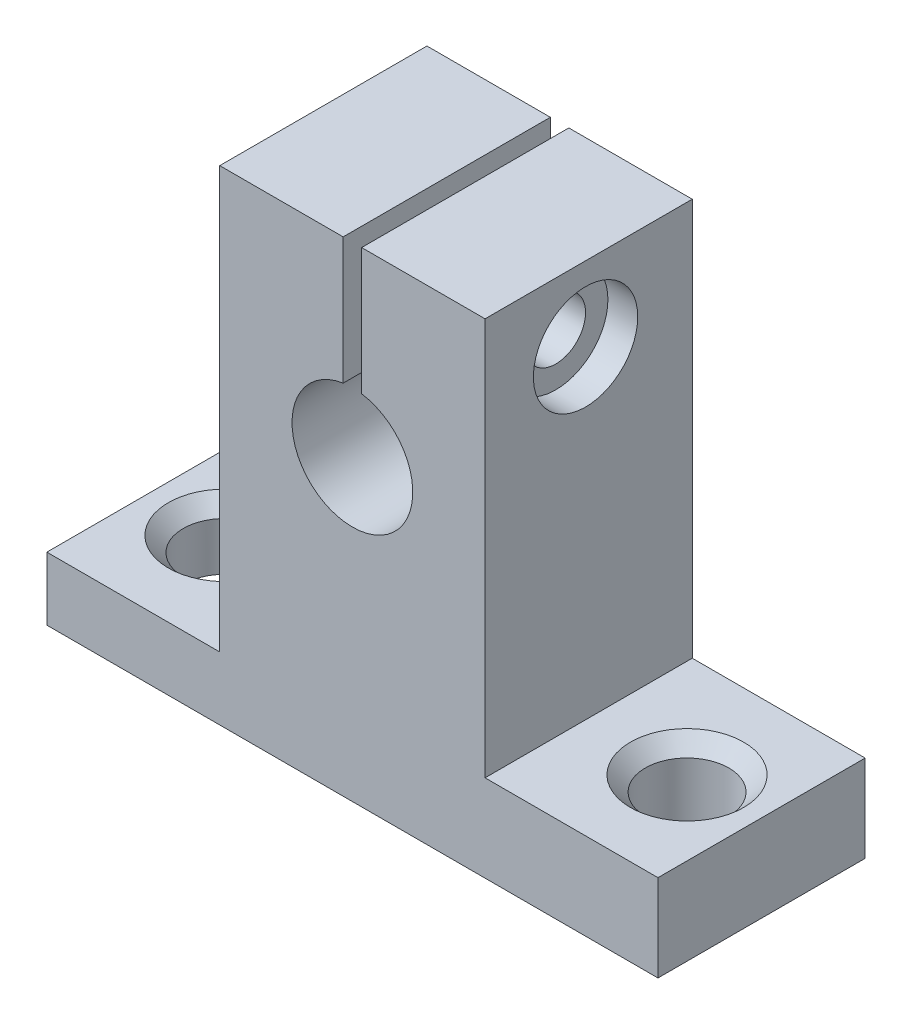
ISO-10303-21;
HEADER;
FILE_DESCRIPTION(('STEP AP214'),'2;1');
FILE_NAME('part.step','',(''),(''),'','','');
FILE_SCHEMA(('AUTOMOTIVE_DESIGN { 1 0 10303 214 1 1 1 1 }'));
ENDSEC;
DATA;
#1=APPLICATION_CONTEXT('core data for automotive mechanical design processes');
#2=APPLICATION_PROTOCOL_DEFINITION('international standard','automotive_design',2000,#1);
#3=PRODUCT_CONTEXT('',#1,'mechanical');
#4=PRODUCT('Part','Part','',(#3));
#5=PRODUCT_RELATED_PRODUCT_CATEGORY('part','',(#4));
#6=PRODUCT_DEFINITION_FORMATION('','',#4);
#7=PRODUCT_DEFINITION_CONTEXT('part definition',#1,'design');
#8=PRODUCT_DEFINITION('design','',#6,#7);
#9=PRODUCT_DEFINITION_SHAPE('','',#8);
#10=(LENGTH_UNIT() NAMED_UNIT(*) SI_UNIT(.MILLI.,.METRE.));
#11=(NAMED_UNIT(*) PLANE_ANGLE_UNIT() SI_UNIT($,.RADIAN.));
#12=(NAMED_UNIT(*) SI_UNIT($,.STERADIAN.) SOLID_ANGLE_UNIT());
#13=UNCERTAINTY_MEASURE_WITH_UNIT(LENGTH_MEASURE(1.E-05),#10,'distance_accuracy_value','');
#14=(GEOMETRIC_REPRESENTATION_CONTEXT(3) GLOBAL_UNCERTAINTY_ASSIGNED_CONTEXT((#13)) GLOBAL_UNIT_ASSIGNED_CONTEXT((#10,
#11,#12)) REPRESENTATION_CONTEXT('',''));
#15=CARTESIAN_POINT('',(0.,0.,0.));
#16=DIRECTION('',(0.,0.,1.));
#17=DIRECTION('',(1.,0.,0.));
#18=AXIS2_PLACEMENT_3D('',#15,#16,#17);
#19=CARTESIAN_POINT('',(0.,4243.44023323615,13900.));
#20=DIRECTION('',(1.,0.,0.));
#21=DIRECTION('',(0.,0.,-1.));
#22=AXIS2_PLACEMENT_3D('',#19,#20,#21);
#23=PLANE('',#22);
#24=DIRECTION('',(0.,-1.,0.));
#25=VECTOR('',#24,1.);
#26=CARTESIAN_POINT('',(0.,4243.44023323615,0.));
#27=LINE('',#26,#25);
#28=CARTESIAN_POINT('',(0.,4243.44023323615,0.));
#29=VERTEX_POINT('',#28);
#30=CARTESIAN_POINT('',(0.,0.,0.));
#31=VERTEX_POINT('',#30);
#32=EDGE_CURVE('E157',#29,#31,#27,.T.);
#33=ORIENTED_EDGE('',*,*,#32,.T.);
#34=DIRECTION('',(0.,0.,-1.));
#35=VECTOR('',#34,1.);
#36=CARTESIAN_POINT('',(0.,0.,13900.));
#37=LINE('',#36,#35);
#38=CARTESIAN_POINT('',(0.,0.,13900.));
#39=VERTEX_POINT('',#38);
#40=EDGE_CURVE('E205',#39,#31,#37,.T.);
#41=ORIENTED_EDGE('',*,*,#40,.F.);
#42=DIRECTION('',(0.,-1.,0.));
#43=VECTOR('',#42,1.);
#44=CARTESIAN_POINT('',(0.,4243.44023323615,13900.));
#45=LINE('',#44,#43);
#46=CARTESIAN_POINT('',(0.,4243.44023323615,13900.));
#47=VERTEX_POINT('',#46);
#48=EDGE_CURVE('E180',#47,#39,#45,.T.);
#49=ORIENTED_EDGE('',*,*,#48,.F.);
#50=DIRECTION('',(0.,0.,-1.));
#51=VECTOR('',#50,1.);
#52=CARTESIAN_POINT('',(0.,4243.44023323615,13900.));
#53=LINE('',#52,#51);
#54=EDGE_CURVE('E153',#47,#29,#53,.T.);
#55=ORIENTED_EDGE('',*,*,#54,.T.);
#56=EDGE_LOOP('',(#33,#41,#49,#55));
#57=FACE_BOUND('',#56,.T.);
#58=ADVANCED_FACE('F35',(#57),#23,.F.);
#59=CARTESIAN_POINT('',(0.,0.,13900.));
#60=DIRECTION('',(0.,1.,0.));
#61=DIRECTION('',(0.,0.,1.));
#62=AXIS2_PLACEMENT_3D('',#59,#60,#61);
#63=PLANE('',#62);
#64=CARTESIAN_POINT('',(5000.,0.,6950.));
#65=DIRECTION('',(0.,1.,0.));
#66=DIRECTION('',(0.,0.,1.));
#67=AXIS2_PLACEMENT_3D('',#64,#65,#66);
#68=CIRCLE('',#67,2800.);
#69=CARTESIAN_POINT('',(5000.,0.,9750.));
#70=VERTEX_POINT('',#69);
#71=EDGE_CURVE('E319',#70,#70,#68,.T.);
#72=ORIENTED_EDGE('',*,*,#71,.T.);
#73=EDGE_LOOP('',(#72));
#74=FACE_BOUND('',#73,.T.);
#75=CARTESIAN_POINT('',(36000.,0.,6950.));
#76=DIRECTION('',(0.,1.,0.));
#77=DIRECTION('',(0.,0.,1.));
#78=AXIS2_PLACEMENT_3D('',#75,#76,#77);
#79=CIRCLE('',#78,2799.99999999999);
#80=CARTESIAN_POINT('',(36000.,0.,9749.99999999999));
#81=VERTEX_POINT('',#80);
#82=EDGE_CURVE('E161',#81,#81,#79,.T.);
#83=ORIENTED_EDGE('',*,*,#82,.T.);
#84=EDGE_LOOP('',(#83));
#85=FACE_BOUND('',#84,.T.);
#86=DIRECTION('',(1.,0.,0.));
#87=VECTOR('',#86,1.);
#88=CARTESIAN_POINT('',(0.,0.,0.));
#89=LINE('',#88,#87);
#90=CARTESIAN_POINT('',(41000.,0.,0.));
#91=VERTEX_POINT('',#90);
#92=EDGE_CURVE('E160',#31,#91,#89,.T.);
#93=ORIENTED_EDGE('',*,*,#92,.T.);
#94=DIRECTION('',(0.,0.,-1.));
#95=VECTOR('',#94,1.);
#96=CARTESIAN_POINT('',(41000.,0.,13900.));
#97=LINE('',#96,#95);
#98=CARTESIAN_POINT('',(41000.,0.,13900.));
#99=VERTEX_POINT('',#98);
#100=EDGE_CURVE('E202',#99,#91,#97,.T.);
#101=ORIENTED_EDGE('',*,*,#100,.F.);
#102=DIRECTION('',(1.,0.,0.));
#103=VECTOR('',#102,1.);
#104=CARTESIAN_POINT('',(0.,0.,13900.));
#105=LINE('',#104,#103);
#106=EDGE_CURVE('E108',#39,#99,#105,.T.);
#107=ORIENTED_EDGE('',*,*,#106,.F.);
#108=ORIENTED_EDGE('',*,*,#40,.T.);
#109=EDGE_LOOP('',(#93,#101,#107,#108));
#110=FACE_BOUND('',#109,.T.);
#111=ADVANCED_FACE('F232',(#74,#85,#110),#63,.F.);
#112=CARTESIAN_POINT('',(41000.,0.,13900.));
#113=DIRECTION('',(-1.,0.,0.));
#114=DIRECTION('',(0.,0.,1.));
#115=AXIS2_PLACEMENT_3D('',#112,#113,#114);
#116=PLANE('',#115);
#117=DIRECTION('',(0.,1.,0.));
#118=VECTOR('',#117,1.);
#119=CARTESIAN_POINT('',(41000.,0.,0.));
#120=LINE('',#119,#118);
#121=CARTESIAN_POINT('',(41000.,5830.,0.));
#122=VERTEX_POINT('',#121);
#123=EDGE_CURVE('E163',#91,#122,#120,.T.);
#124=ORIENTED_EDGE('',*,*,#123,.T.);
#125=DIRECTION('',(0.,0.,-1.));
#126=VECTOR('',#125,1.);
#127=CARTESIAN_POINT('',(41000.,5830.,13900.));
#128=LINE('',#127,#126);
#129=CARTESIAN_POINT('',(41000.,5830.,13900.));
#130=VERTEX_POINT('',#129);
#131=EDGE_CURVE('E199',#130,#122,#128,.T.);
#132=ORIENTED_EDGE('',*,*,#131,.F.);
#133=DIRECTION('',(0.,1.,0.));
#134=VECTOR('',#133,1.);
#135=CARTESIAN_POINT('',(41000.,0.,13900.));
#136=LINE('',#135,#134);
#137=EDGE_CURVE('E327',#99,#130,#136,.T.);
#138=ORIENTED_EDGE('',*,*,#137,.F.);
#139=ORIENTED_EDGE('',*,*,#100,.T.);
#140=EDGE_LOOP('',(#124,#132,#138,#139));
#141=FACE_BOUND('',#140,.T.);
#142=ADVANCED_FACE('F238',(#141),#116,.F.);
#143=CARTESIAN_POINT('',(41000.,5830.,13900.));
#144=DIRECTION('',(0.,-1.,0.));
#145=DIRECTION('',(1.,0.,0.));
#146=AXIS2_PLACEMENT_3D('',#143,#144,#145);
#147=PLANE('',#146);
#148=CARTESIAN_POINT('',(36000.,5830.,6950.));
#149=DIRECTION('',(0.,-1.,0.));
#150=DIRECTION('',(1.,0.,0.));
#151=AXIS2_PLACEMENT_3D('',#148,#149,#150);
#152=CIRCLE('',#151,3799.99999999999);
#153=CARTESIAN_POINT('',(39800.,5830.,6950.));
#154=VERTEX_POINT('',#153);
#155=EDGE_CURVE('E210',#154,#154,#152,.T.);
#156=ORIENTED_EDGE('',*,*,#155,.T.);
#157=EDGE_LOOP('',(#156));
#158=FACE_BOUND('',#157,.T.);
#159=DIRECTION('',(-1.,0.,0.));
#160=VECTOR('',#159,1.);
#161=CARTESIAN_POINT('',(41000.,5830.,0.));
#162=LINE('',#161,#160);
#163=CARTESIAN_POINT('',(29400.,5830.,0.));
#164=VERTEX_POINT('',#163);
#165=EDGE_CURVE('E165',#122,#164,#162,.T.);
#166=ORIENTED_EDGE('',*,*,#165,.T.);
#167=DIRECTION('',(0.,0.,-1.));
#168=VECTOR('',#167,1.);
#169=CARTESIAN_POINT('',(29400.,5830.,13900.));
#170=LINE('',#169,#168);
#171=CARTESIAN_POINT('',(29400.,5830.,13900.));
#172=VERTEX_POINT('',#171);
#173=EDGE_CURVE('E196',#172,#164,#170,.T.);
#174=ORIENTED_EDGE('',*,*,#173,.F.);
#175=DIRECTION('',(-1.,0.,0.));
#176=VECTOR('',#175,1.);
#177=CARTESIAN_POINT('',(41000.,5830.,13900.));
#178=LINE('',#177,#176);
#179=EDGE_CURVE('E329',#130,#172,#178,.T.);
#180=ORIENTED_EDGE('',*,*,#179,.F.);
#181=ORIENTED_EDGE('',*,*,#131,.T.);
#182=EDGE_LOOP('',(#166,#174,#180,#181));
#183=FACE_BOUND('',#182,.T.);
#184=ADVANCED_FACE('F244',(#158,#183),#147,.F.);
#185=CARTESIAN_POINT('',(29400.,5830.,13900.));
#186=DIRECTION('',(-1.,0.,0.));
#187=DIRECTION('',(0.,0.,1.));
#188=AXIS2_PLACEMENT_3D('',#185,#186,#187);
#189=PLANE('',#188);
#190=CARTESIAN_POINT('',(29400.,27500.,7158.27634771547));
#191=DIRECTION('',(1.,0.,0.));
#192=DIRECTION('',(0.,0.,-1.));
#193=AXIS2_PLACEMENT_3D('',#190,#191,#192);
#194=CIRCLE('',#193,3500.);
#195=CARTESIAN_POINT('',(29400.,27500.,3658.27634771547));
#196=VERTEX_POINT('',#195);
#197=EDGE_CURVE('E307',#196,#196,#194,.T.);
#198=ORIENTED_EDGE('',*,*,#197,.F.);
#199=EDGE_LOOP('',(#198));
#200=FACE_BOUND('',#199,.T.);
#201=DIRECTION('',(0.,1.,0.));
#202=VECTOR('',#201,1.);
#203=CARTESIAN_POINT('',(29400.,5830.,0.));
#204=LINE('',#203,#202);
#205=CARTESIAN_POINT('',(29400.,32500.,0.));
#206=VERTEX_POINT('',#205);
#207=EDGE_CURVE('E167',#164,#206,#204,.T.);
#208=ORIENTED_EDGE('',*,*,#207,.T.);
#209=DIRECTION('',(0.,0.,-1.));
#210=VECTOR('',#209,1.);
#211=CARTESIAN_POINT('',(29400.,32500.,13900.));
#212=LINE('',#211,#210);
#213=CARTESIAN_POINT('',(29400.,32500.,13900.));
#214=VERTEX_POINT('',#213);
#215=EDGE_CURVE('E193',#214,#206,#212,.T.);
#216=ORIENTED_EDGE('',*,*,#215,.F.);
#217=DIRECTION('',(0.,1.,0.));
#218=VECTOR('',#217,1.);
#219=CARTESIAN_POINT('',(29400.,5830.,13900.));
#220=LINE('',#219,#218);
#221=EDGE_CURVE('E331',#172,#214,#220,.T.);
#222=ORIENTED_EDGE('',*,*,#221,.F.);
#223=ORIENTED_EDGE('',*,*,#173,.T.);
#224=EDGE_LOOP('',(#208,#216,#222,#223));
#225=FACE_BOUND('',#224,.T.);
#226=ADVANCED_FACE('F248',(#200,#225),#189,.F.);
#227=CARTESIAN_POINT('',(29400.,32500.,13900.));
#228=DIRECTION('',(0.,-1.,0.));
#229=DIRECTION('',(0.,0.,-1.));
#230=AXIS2_PLACEMENT_3D('',#227,#228,#229);
#231=PLANE('',#230);
#232=DIRECTION('',(-1.,0.,0.));
#233=VECTOR('',#232,1.);
#234=CARTESIAN_POINT('',(29400.,32500.,0.));
#235=LINE('',#234,#233);
#236=CARTESIAN_POINT('',(21120.,32500.,0.));
#237=VERTEX_POINT('',#236);
#238=EDGE_CURVE('E169',#206,#237,#235,.T.);
#239=ORIENTED_EDGE('',*,*,#238,.T.);
#240=DIRECTION('',(0.,0.,-1.));
#241=VECTOR('',#240,1.);
#242=CARTESIAN_POINT('',(21120.,32500.,13900.));
#243=LINE('',#242,#241);
#244=CARTESIAN_POINT('',(21120.,32500.,13900.));
#245=VERTEX_POINT('',#244);
#246=EDGE_CURVE('E190',#245,#237,#243,.T.);
#247=ORIENTED_EDGE('',*,*,#246,.F.);
#248=DIRECTION('',(-1.,0.,0.));
#249=VECTOR('',#248,1.);
#250=CARTESIAN_POINT('',(29400.,32500.,13900.));
#251=LINE('',#250,#249);
#252=EDGE_CURVE('E333',#214,#245,#251,.T.);
#253=ORIENTED_EDGE('',*,*,#252,.F.);
#254=ORIENTED_EDGE('',*,*,#215,.T.);
#255=EDGE_LOOP('',(#239,#247,#253,#254));
#256=FACE_BOUND('',#255,.T.);
#257=ADVANCED_FACE('F252',(#256),#231,.F.);
#258=CARTESIAN_POINT('',(21120.,24002.2618604984,13900.));
#259=DIRECTION('',(1.,0.,0.));
#260=DIRECTION('',(0.,1.,0.));
#261=AXIS2_PLACEMENT_3D('',#258,#259,#260);
#262=PLANE('',#261);
#263=CARTESIAN_POINT('',(21120.,27500.,7158.27634771547));
#264=DIRECTION('',(1.,0.,0.));
#265=DIRECTION('',(0.,1.,0.));
#266=AXIS2_PLACEMENT_3D('',#263,#264,#265);
#267=CIRCLE('',#266,2000.);
#268=CARTESIAN_POINT('',(21120.,29500.,7158.27634771547));
#269=VERTEX_POINT('',#268);
#270=EDGE_CURVE('E306',#269,#269,#267,.T.);
#271=ORIENTED_EDGE('',*,*,#270,.T.);
#272=EDGE_LOOP('',(#271));
#273=FACE_BOUND('',#272,.T.);
#274=DIRECTION('',(0.,-1.,0.));
#275=VECTOR('',#274,1.);
#276=CARTESIAN_POINT('',(21120.,24002.2618604984,0.));
#277=LINE('',#276,#275);
#278=CARTESIAN_POINT('',(21120.,24002.2618604984,0.));
#279=VERTEX_POINT('',#278);
#280=EDGE_CURVE('E171',#237,#279,#277,.T.);
#281=ORIENTED_EDGE('',*,*,#280,.T.);
#282=DIRECTION('',(0.,0.,-1.));
#283=VECTOR('',#282,1.);
#284=CARTESIAN_POINT('',(21120.,24002.2618604984,13900.));
#285=LINE('',#284,#283);
#286=CARTESIAN_POINT('',(21120.,24002.2618604984,13900.));
#287=VERTEX_POINT('',#286);
#288=EDGE_CURVE('E187',#287,#279,#285,.T.);
#289=ORIENTED_EDGE('',*,*,#288,.F.);
#290=DIRECTION('',(0.,-1.,0.));
#291=VECTOR('',#290,1.);
#292=CARTESIAN_POINT('',(21120.,24002.2618604984,13900.));
#293=LINE('',#292,#291);
#294=EDGE_CURVE('E335',#245,#287,#293,.T.);
#295=ORIENTED_EDGE('',*,*,#294,.F.);
#296=ORIENTED_EDGE('',*,*,#246,.T.);
#297=EDGE_LOOP('',(#281,#289,#295,#296));
#298=FACE_BOUND('',#297,.T.);
#299=ADVANCED_FACE('F256',(#273,#298),#262,.F.);
#300=CARTESIAN_POINT('',(20500.,20000.,13900.));
#301=DIRECTION('',(0.,0.,-1.));
#302=DIRECTION('',(-1.,0.,0.));
#303=AXIS2_PLACEMENT_3D('',#300,#301,#302);
#304=CYLINDRICAL_SURFACE('',#303,4050.);
#305=CARTESIAN_POINT('',(20500.,20000.,0.));
#306=DIRECTION('',(0.,0.,-1.));
#307=DIRECTION('',(1.,0.,0.));
#308=AXIS2_PLACEMENT_3D('',#305,#306,#307);
#309=CIRCLE('',#308,4050.);
#310=CARTESIAN_POINT('',(19880.,24002.2618604984,0.));
#311=VERTEX_POINT('',#310);
#312=EDGE_CURVE('E173',#279,#311,#309,.T.);
#313=ORIENTED_EDGE('',*,*,#312,.T.);
#314=DIRECTION('',(0.,0.,-1.));
#315=VECTOR('',#314,1.);
#316=CARTESIAN_POINT('',(19880.,24002.2618604984,13900.));
#317=LINE('',#316,#315);
#318=CARTESIAN_POINT('',(19880.,24002.2618604984,13900.));
#319=VERTEX_POINT('',#318);
#320=EDGE_CURVE('E184',#319,#311,#317,.T.);
#321=ORIENTED_EDGE('',*,*,#320,.F.);
#322=CARTESIAN_POINT('',(20500.,20000.,13900.));
#323=DIRECTION('',(0.,0.,-1.));
#324=DIRECTION('',(1.,0.,0.));
#325=AXIS2_PLACEMENT_3D('',#322,#323,#324);
#326=CIRCLE('',#325,4050.);
#327=EDGE_CURVE('E337',#287,#319,#326,.T.);
#328=ORIENTED_EDGE('',*,*,#327,.F.);
#329=ORIENTED_EDGE('',*,*,#288,.T.);
#330=EDGE_LOOP('',(#313,#321,#328,#329));
#331=FACE_BOUND('',#330,.T.);
#332=ADVANCED_FACE('F260',(#331),#304,.F.);
#333=CARTESIAN_POINT('',(19880.,24002.2618604984,13900.));
#334=DIRECTION('',(-1.,0.,0.));
#335=DIRECTION('',(0.,-1.,0.));
#336=AXIS2_PLACEMENT_3D('',#333,#334,#335);
#337=PLANE('',#336);
#338=CARTESIAN_POINT('',(19880.,27500.,7158.27634771547));
#339=DIRECTION('',(-1.,0.,0.));
#340=DIRECTION('',(0.,-1.,0.));
#341=AXIS2_PLACEMENT_3D('',#338,#339,#340);
#342=CIRCLE('',#341,2000.);
#343=CARTESIAN_POINT('',(19880.,25500.,7158.27634771547));
#344=VERTEX_POINT('',#343);
#345=EDGE_CURVE('E308',#344,#344,#342,.T.);
#346=ORIENTED_EDGE('',*,*,#345,.T.);
#347=EDGE_LOOP('',(#346));
#348=FACE_BOUND('',#347,.T.);
#349=DIRECTION('',(0.,1.,0.));
#350=VECTOR('',#349,1.);
#351=CARTESIAN_POINT('',(19880.,24002.2618604984,0.));
#352=LINE('',#351,#350);
#353=CARTESIAN_POINT('',(19880.,32500.,0.));
#354=VERTEX_POINT('',#353);
#355=EDGE_CURVE('E175',#311,#354,#352,.T.);
#356=ORIENTED_EDGE('',*,*,#355,.T.);
#357=DIRECTION('',(0.,0.,-1.));
#358=VECTOR('',#357,1.);
#359=CARTESIAN_POINT('',(19880.,32500.,13900.));
#360=LINE('',#359,#358);
#361=CARTESIAN_POINT('',(19880.,32500.,13900.));
#362=VERTEX_POINT('',#361);
#363=EDGE_CURVE('E148',#362,#354,#360,.T.);
#364=ORIENTED_EDGE('',*,*,#363,.F.);
#365=DIRECTION('',(0.,1.,0.));
#366=VECTOR('',#365,1.);
#367=CARTESIAN_POINT('',(19880.,24002.2618604984,13900.));
#368=LINE('',#367,#366);
#369=EDGE_CURVE('E139',#319,#362,#368,.T.);
#370=ORIENTED_EDGE('',*,*,#369,.F.);
#371=ORIENTED_EDGE('',*,*,#320,.T.);
#372=EDGE_LOOP('',(#356,#364,#370,#371));
#373=FACE_BOUND('',#372,.T.);
#374=ADVANCED_FACE('F264',(#348,#373),#337,.F.);
#375=CARTESIAN_POINT('',(19880.,32500.,13900.));
#376=DIRECTION('',(0.,-1.,0.));
#377=DIRECTION('',(0.,0.,-1.));
#378=AXIS2_PLACEMENT_3D('',#375,#376,#377);
#379=PLANE('',#378);
#380=DIRECTION('',(-1.,0.,0.));
#381=VECTOR('',#380,1.);
#382=CARTESIAN_POINT('',(19880.,32500.,0.));
#383=LINE('',#382,#381);
#384=CARTESIAN_POINT('',(11600.,32500.,0.));
#385=VERTEX_POINT('',#384);
#386=EDGE_CURVE('E147',#354,#385,#383,.T.);
#387=ORIENTED_EDGE('',*,*,#386,.T.);
#388=DIRECTION('',(0.,0.,-1.));
#389=VECTOR('',#388,1.);
#390=CARTESIAN_POINT('',(11600.,32500.,13900.));
#391=LINE('',#390,#389);
#392=CARTESIAN_POINT('',(11600.,32500.,13900.));
#393=VERTEX_POINT('',#392);
#394=EDGE_CURVE('E144',#393,#385,#391,.T.);
#395=ORIENTED_EDGE('',*,*,#394,.F.);
#396=DIRECTION('',(-1.,0.,0.));
#397=VECTOR('',#396,1.);
#398=CARTESIAN_POINT('',(19880.,32500.,13900.));
#399=LINE('',#398,#397);
#400=EDGE_CURVE('E133',#362,#393,#399,.T.);
#401=ORIENTED_EDGE('',*,*,#400,.F.);
#402=ORIENTED_EDGE('',*,*,#363,.T.);
#403=EDGE_LOOP('',(#387,#395,#401,#402));
#404=FACE_BOUND('',#403,.T.);
#405=ADVANCED_FACE('F145',(#404),#379,.F.);
#406=CARTESIAN_POINT('',(11600.,32500.,13900.));
#407=DIRECTION('',(1.,0.,0.));
#408=DIRECTION('',(0.,1.,0.));
#409=AXIS2_PLACEMENT_3D('',#406,#407,#408);
#410=PLANE('',#409);
#411=CARTESIAN_POINT('',(11600.,27500.,7158.27634771547));
#412=DIRECTION('',(1.,0.,0.));
#413=DIRECTION('',(0.,1.,0.));
#414=AXIS2_PLACEMENT_3D('',#411,#412,#413);
#415=CIRCLE('',#414,2000.);
#416=CARTESIAN_POINT('',(11600.,29500.,7158.27634771547));
#417=VERTEX_POINT('',#416);
#418=EDGE_CURVE('E314',#417,#417,#415,.T.);
#419=ORIENTED_EDGE('',*,*,#418,.T.);
#420=EDGE_LOOP('',(#419));
#421=FACE_BOUND('',#420,.T.);
#422=DIRECTION('',(0.,-1.,0.));
#423=VECTOR('',#422,1.);
#424=CARTESIAN_POINT('',(11600.,32500.,0.));
#425=LINE('',#424,#423);
#426=CARTESIAN_POINT('',(11600.,4243.44023323616,0.));
#427=VERTEX_POINT('',#426);
#428=EDGE_CURVE('E93',#385,#427,#425,.T.);
#429=ORIENTED_EDGE('',*,*,#428,.T.);
#430=DIRECTION('',(0.,0.,-1.));
#431=VECTOR('',#430,1.);
#432=CARTESIAN_POINT('',(11600.,4243.44023323616,13900.));
#433=LINE('',#432,#431);
#434=CARTESIAN_POINT('',(11600.,4243.44023323616,13900.));
#435=VERTEX_POINT('',#434);
#436=EDGE_CURVE('E149',#435,#427,#433,.T.);
#437=ORIENTED_EDGE('',*,*,#436,.F.);
#438=DIRECTION('',(0.,-1.,0.));
#439=VECTOR('',#438,1.);
#440=CARTESIAN_POINT('',(11600.,32500.,13900.));
#441=LINE('',#440,#439);
#442=EDGE_CURVE('E137',#393,#435,#441,.T.);
#443=ORIENTED_EDGE('',*,*,#442,.F.);
#444=ORIENTED_EDGE('',*,*,#394,.T.);
#445=EDGE_LOOP('',(#429,#437,#443,#444));
#446=FACE_BOUND('',#445,.T.);
#447=ADVANCED_FACE('F151',(#421,#446),#410,.F.);
#448=CARTESIAN_POINT('',(11600.,4243.44023323616,13900.));
#449=DIRECTION('',(0.,-1.,0.));
#450=DIRECTION('',(1.,0.,0.));
#451=AXIS2_PLACEMENT_3D('',#448,#449,#450);
#452=PLANE('',#451);
#453=CARTESIAN_POINT('',(5000.,4243.44023323615,6950.));
#454=DIRECTION('',(0.,-1.,0.));
#455=DIRECTION('',(1.,0.,0.));
#456=AXIS2_PLACEMENT_3D('',#453,#454,#455);
#457=CIRCLE('',#456,3800.);
#458=CARTESIAN_POINT('',(8799.99999999999,4243.44023323615,6950.));
#459=VERTEX_POINT('',#458);
#460=EDGE_CURVE('E44',#459,#459,#457,.T.);
#461=ORIENTED_EDGE('',*,*,#460,.T.);
#462=EDGE_LOOP('',(#461));
#463=FACE_BOUND('',#462,.T.);
#464=DIRECTION('',(-1.,0.,0.));
#465=VECTOR('',#464,1.);
#466=CARTESIAN_POINT('',(11600.,4243.44023323616,0.));
#467=LINE('',#466,#465);
#468=EDGE_CURVE('E99',#427,#29,#467,.T.);
#469=ORIENTED_EDGE('',*,*,#468,.T.);
#470=ORIENTED_EDGE('',*,*,#54,.F.);
#471=DIRECTION('',(-1.,0.,0.));
#472=VECTOR('',#471,1.);
#473=CARTESIAN_POINT('',(11600.,4243.44023323616,13900.));
#474=LINE('',#473,#472);
#475=EDGE_CURVE('E52',#435,#47,#474,.T.);
#476=ORIENTED_EDGE('',*,*,#475,.F.);
#477=ORIENTED_EDGE('',*,*,#436,.T.);
#478=EDGE_LOOP('',(#469,#470,#476,#477));
#479=FACE_BOUND('',#478,.T.);
#480=ADVANCED_FACE('F215',(#463,#479),#452,.F.);
#481=CARTESIAN_POINT('',(20500.,20000.,13900.));
#482=DIRECTION('',(0.,0.,1.));
#483=DIRECTION('',(1.,0.,0.));
#484=AXIS2_PLACEMENT_3D('',#481,#482,#483);
#485=PLANE('',#484);
#486=ORIENTED_EDGE('',*,*,#48,.T.);
#487=ORIENTED_EDGE('',*,*,#106,.T.);
#488=ORIENTED_EDGE('',*,*,#137,.T.);
#489=ORIENTED_EDGE('',*,*,#179,.T.);
#490=ORIENTED_EDGE('',*,*,#221,.T.);
#491=ORIENTED_EDGE('',*,*,#252,.T.);
#492=ORIENTED_EDGE('',*,*,#294,.T.);
#493=ORIENTED_EDGE('',*,*,#327,.T.);
#494=ORIENTED_EDGE('',*,*,#369,.T.);
#495=ORIENTED_EDGE('',*,*,#400,.T.);
#496=ORIENTED_EDGE('',*,*,#442,.T.);
#497=ORIENTED_EDGE('',*,*,#475,.T.);
#498=EDGE_LOOP('',(#486,#487,#488,#489,#490,#491,#492,#493,#494,#495,#496,#497));
#499=FACE_BOUND('',#498,.T.);
#500=ADVANCED_FACE('F135',(#499),#485,.T.);
#501=CARTESIAN_POINT('',(20500.,20000.,0.));
#502=DIRECTION('',(0.,0.,1.));
#503=DIRECTION('',(1.,0.,0.));
#504=AXIS2_PLACEMENT_3D('',#501,#502,#503);
#505=PLANE('',#504);
#506=ORIENTED_EDGE('',*,*,#32,.F.);
#507=ORIENTED_EDGE('',*,*,#468,.F.);
#508=ORIENTED_EDGE('',*,*,#428,.F.);
#509=ORIENTED_EDGE('',*,*,#386,.F.);
#510=ORIENTED_EDGE('',*,*,#355,.F.);
#511=ORIENTED_EDGE('',*,*,#312,.F.);
#512=ORIENTED_EDGE('',*,*,#280,.F.);
#513=ORIENTED_EDGE('',*,*,#238,.F.);
#514=ORIENTED_EDGE('',*,*,#207,.F.);
#515=ORIENTED_EDGE('',*,*,#165,.F.);
#516=ORIENTED_EDGE('',*,*,#123,.F.);
#517=ORIENTED_EDGE('',*,*,#92,.F.);
#518=EDGE_LOOP('',(#506,#507,#508,#509,#510,#511,#512,#513,#514,#515,#516,#517));
#519=FACE_BOUND('',#518,.T.);
#520=ADVANCED_FACE('F276',(#519),#505,.F.);
#521=CARTESIAN_POINT('',(36000.,-8070.,6950.));
#522=DIRECTION('',(0.,1.,0.));
#523=DIRECTION('',(-1.,0.,0.));
#524=AXIS2_PLACEMENT_3D('',#521,#522,#523);
#525=CYLINDRICAL_SURFACE('',#524,2799.99999999999);
#526=CARTESIAN_POINT('',(36000.,4829.99999999999,6950.));
#527=DIRECTION('',(0.,-1.,0.));
#528=DIRECTION('',(0.,0.,-1.));
#529=AXIS2_PLACEMENT_3D('',#526,#527,#528);
#530=CIRCLE('',#529,2799.99999999999);
#531=CARTESIAN_POINT('',(36000.,4829.99999999999,4150.00000000001));
#532=VERTEX_POINT('',#531);
#533=EDGE_CURVE('E207',#532,#532,#530,.F.);
#534=ORIENTED_EDGE('',*,*,#533,.T.);
#535=EDGE_LOOP('',(#534));
#536=FACE_BOUND('',#535,.T.);
#537=ORIENTED_EDGE('',*,*,#82,.F.);
#538=EDGE_LOOP('',(#537));
#539=FACE_BOUND('',#538,.T.);
#540=ADVANCED_FACE('F279',(#536,#539),#525,.F.);
#541=CARTESIAN_POINT('',(5000.,-8070.00000000001,6950.));
#542=DIRECTION('',(0.,1.,0.));
#543=DIRECTION('',(-1.,0.,0.));
#544=AXIS2_PLACEMENT_3D('',#541,#542,#543);
#545=CYLINDRICAL_SURFACE('',#544,2800.);
#546=CARTESIAN_POINT('',(5000.,3243.44023323616,6950.));
#547=DIRECTION('',(0.,-1.,0.));
#548=DIRECTION('',(0.,0.,-1.));
#549=AXIS2_PLACEMENT_3D('',#546,#547,#548);
#550=CIRCLE('',#549,2800.);
#551=CARTESIAN_POINT('',(5000.,3243.44023323616,4150.));
#552=VERTEX_POINT('',#551);
#553=EDGE_CURVE('E11',#552,#552,#550,.F.);
#554=ORIENTED_EDGE('',*,*,#553,.T.);
#555=EDGE_LOOP('',(#554));
#556=FACE_BOUND('',#555,.T.);
#557=ORIENTED_EDGE('',*,*,#71,.F.);
#558=EDGE_LOOP('',(#557));
#559=FACE_BOUND('',#558,.T.);
#560=ADVANCED_FACE('F228',(#556,#559),#545,.F.);
#561=CARTESIAN_POINT('',(36000.,4829.99999999999,6950.));
#562=DIRECTION('',(0.,1.,0.));
#563=DIRECTION('',(0.,0.,1.));
#564=AXIS2_PLACEMENT_3D('',#561,#562,#563);
#565=CONICAL_SURFACE('',#564,2799.99999999999,0.785398163397444);
#566=ORIENTED_EDGE('',*,*,#155,.F.);
#567=EDGE_LOOP('',(#566));
#568=FACE_BOUND('',#567,.T.);
#569=ORIENTED_EDGE('',*,*,#533,.F.);
#570=EDGE_LOOP('',(#569));
#571=FACE_BOUND('',#570,.T.);
#572=ADVANCED_FACE('F219',(#568,#571),#565,.F.);
#573=CARTESIAN_POINT('',(5000.,4243.44023323616,6950.));
#574=DIRECTION('',(0.,1.,0.));
#575=DIRECTION('',(0.,0.,1.));
#576=AXIS2_PLACEMENT_3D('',#573,#574,#575);
#577=CONICAL_SURFACE('',#576,3800.,0.785398163397446);
#578=ORIENTED_EDGE('',*,*,#553,.F.);
#579=EDGE_LOOP('',(#578));
#580=FACE_BOUND('',#579,.T.);
#581=ORIENTED_EDGE('',*,*,#460,.F.);
#582=EDGE_LOOP('',(#581));
#583=FACE_BOUND('',#582,.T.);
#584=ADVANCED_FACE('F37',(#580,#583),#577,.F.);
#585=CARTESIAN_POINT('',(27400.,27500.,7158.27634771547));
#586=DIRECTION('',(1.,0.,0.));
#587=DIRECTION('',(0.,0.,-1.));
#588=AXIS2_PLACEMENT_3D('',#585,#586,#587);
#589=CYLINDRICAL_SURFACE('',#588,3500.);
#590=CARTESIAN_POINT('',(27400.,27500.,7158.27634771547));
#591=DIRECTION('',(1.,0.,0.));
#592=DIRECTION('',(0.,0.,-1.));
#593=AXIS2_PLACEMENT_3D('',#590,#591,#592);
#594=CIRCLE('',#593,3500.);
#595=CARTESIAN_POINT('',(27400.,27500.,3658.27634771547));
#596=VERTEX_POINT('',#595);
#597=EDGE_CURVE('E311',#596,#596,#594,.T.);
#598=ORIENTED_EDGE('',*,*,#597,.F.);
#599=EDGE_LOOP('',(#598));
#600=FACE_BOUND('',#599,.T.);
#601=ORIENTED_EDGE('',*,*,#197,.T.);
#602=EDGE_LOOP('',(#601));
#603=FACE_BOUND('',#602,.T.);
#604=ADVANCED_FACE('F218',(#600,#603),#589,.F.);
#605=CARTESIAN_POINT('',(27400.,27500.,7158.27634771547));
#606=DIRECTION('',(1.,0.,0.));
#607=DIRECTION('',(0.,0.,-1.));
#608=AXIS2_PLACEMENT_3D('',#605,#606,#607);
#609=PLANE('',#608);
#610=CARTESIAN_POINT('',(27400.,27500.,7158.27634771547));
#611=DIRECTION('',(1.,0.,0.));
#612=DIRECTION('',(0.,0.,-1.));
#613=AXIS2_PLACEMENT_3D('',#610,#611,#612);
#614=CIRCLE('',#613,2000.);
#615=CARTESIAN_POINT('',(27400.,27500.,5158.27634771547));
#616=VERTEX_POINT('',#615);
#617=EDGE_CURVE('E303',#616,#616,#614,.T.);
#618=ORIENTED_EDGE('',*,*,#617,.F.);
#619=EDGE_LOOP('',(#618));
#620=FACE_BOUND('',#619,.T.);
#621=ORIENTED_EDGE('',*,*,#597,.T.);
#622=EDGE_LOOP('',(#621));
#623=FACE_BOUND('',#622,.T.);
#624=ADVANCED_FACE('F225',(#620,#623),#609,.T.);
#625=CARTESIAN_POINT('',(2862.,27500.,7158.27634771547));
#626=DIRECTION('',(1.,0.,0.));
#627=DIRECTION('',(0.,0.,-1.));
#628=AXIS2_PLACEMENT_3D('',#625,#626,#627);
#629=CYLINDRICAL_SURFACE('',#628,2000.);
#630=ORIENTED_EDGE('',*,*,#617,.T.);
#631=EDGE_LOOP('',(#630));
#632=FACE_BOUND('',#631,.T.);
#633=ORIENTED_EDGE('',*,*,#270,.F.);
#634=EDGE_LOOP('',(#633));
#635=FACE_BOUND('',#634,.T.);
#636=ADVANCED_FACE('F291',(#632,#635),#629,.F.);
#637=ORIENTED_EDGE('',*,*,#418,.F.);
#638=EDGE_LOOP('',(#637));
#639=FACE_BOUND('',#638,.T.);
#640=ORIENTED_EDGE('',*,*,#345,.F.);
#641=EDGE_LOOP('',(#640));
#642=FACE_BOUND('',#641,.T.);
#643=ADVANCED_FACE('F294',(#639,#642),#629,.F.);
#644=CLOSED_SHELL('',(#58,#111,#142,#184,#226,#257,#299,#332,#374,#405,#447,#480,#500,#520,#540,
#560,#572,#584,#604,#624,#636,#643));
#645=MANIFOLD_SOLID_BREP('B2',#644);
#646=ADVANCED_BREP_SHAPE_REPRESENTATION('',(#18,#645),#14);
#647=SHAPE_DEFINITION_REPRESENTATION(#9,#646);
ENDSEC;
END-ISO-10303-21;
